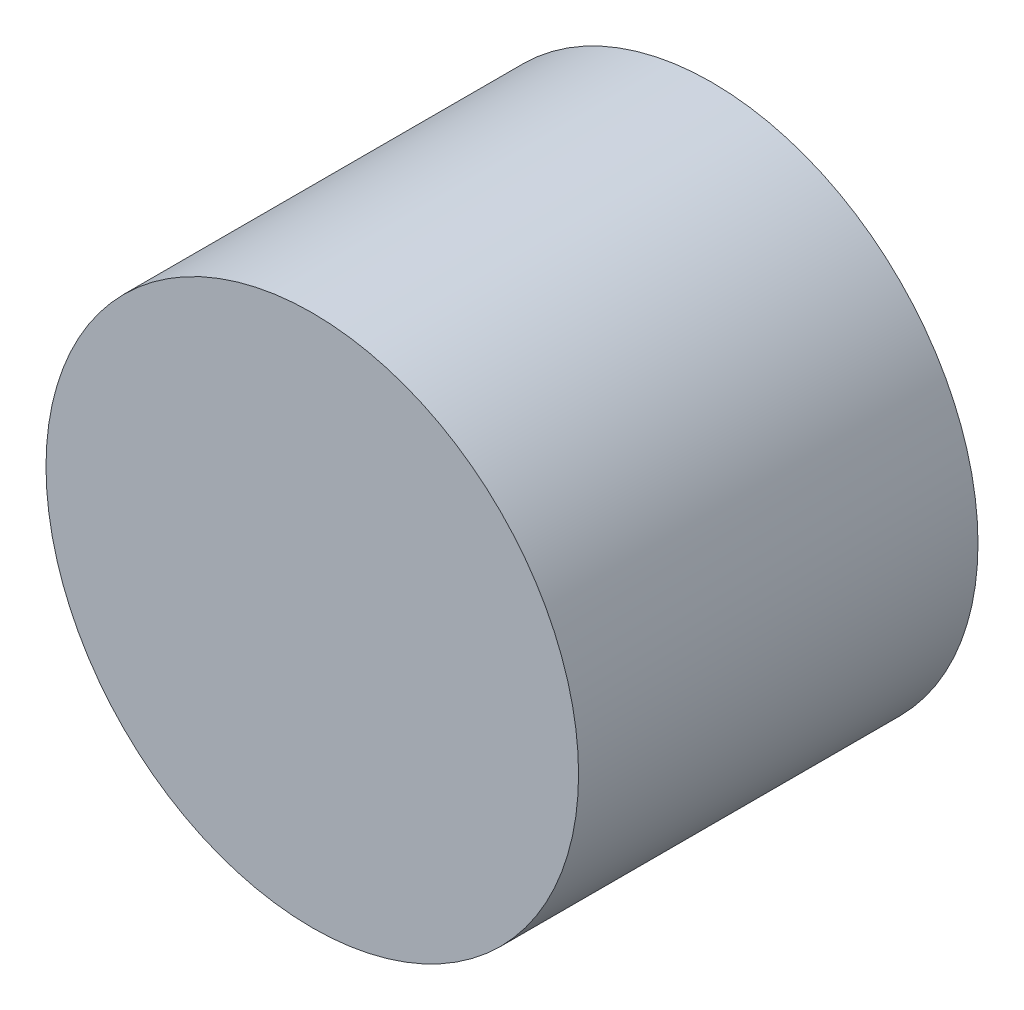
ISO-10303-21;
HEADER;
FILE_DESCRIPTION(('STEP AP214'),'2;1');
FILE_NAME('part.step','',(''),(''),'','','');
FILE_SCHEMA(('AUTOMOTIVE_DESIGN { 1 0 10303 214 1 1 1 1 }'));
ENDSEC;
DATA;
#1=APPLICATION_CONTEXT('core data for automotive mechanical design processes');
#2=APPLICATION_PROTOCOL_DEFINITION('international standard','automotive_design',2000,#1);
#3=PRODUCT_CONTEXT('',#1,'mechanical');
#4=PRODUCT('Part','Part','',(#3));
#5=PRODUCT_RELATED_PRODUCT_CATEGORY('part','',(#4));
#6=PRODUCT_DEFINITION_FORMATION('','',#4);
#7=PRODUCT_DEFINITION_CONTEXT('part definition',#1,'design');
#8=PRODUCT_DEFINITION('design','',#6,#7);
#9=PRODUCT_DEFINITION_SHAPE('','',#8);
#10=(LENGTH_UNIT() NAMED_UNIT(*) SI_UNIT(.MILLI.,.METRE.));
#11=(NAMED_UNIT(*) PLANE_ANGLE_UNIT() SI_UNIT($,.RADIAN.));
#12=(NAMED_UNIT(*) SI_UNIT($,.STERADIAN.) SOLID_ANGLE_UNIT());
#13=UNCERTAINTY_MEASURE_WITH_UNIT(LENGTH_MEASURE(1.E-05),#10,'distance_accuracy_value','');
#14=(GEOMETRIC_REPRESENTATION_CONTEXT(3) GLOBAL_UNCERTAINTY_ASSIGNED_CONTEXT((#13)) GLOBAL_UNIT_ASSIGNED_CONTEXT((#10,
#11,#12)) REPRESENTATION_CONTEXT('',''));
#15=CARTESIAN_POINT('',(0.,0.,0.));
#16=DIRECTION('',(0.,0.,1.));
#17=DIRECTION('',(1.,0.,0.));
#18=AXIS2_PLACEMENT_3D('',#15,#16,#17);
#19=CARTESIAN_POINT('',(0.,0.,10.));
#20=DIRECTION('',(0.,0.,-1.));
#21=DIRECTION('',(-1.,0.,0.));
#22=AXIS2_PLACEMENT_3D('',#19,#20,#21);
#23=SPHERICAL_SURFACE('',#22,10.);
#24=CARTESIAN_POINT('',(0.,0.,10.));
#25=DIRECTION('',(0.,0.,-1.));
#26=DIRECTION('',(-1.,0.,0.));
#27=AXIS2_PLACEMENT_3D('',#24,#25,#26);
#28=CIRCLE('',#27,10.);
#29=CARTESIAN_POINT('',(-10.,0.,10.));
#30=VERTEX_POINT('',#29);
#31=EDGE_CURVE('E10',#30,#30,#28,.T.);
#32=ORIENTED_EDGE('',*,*,#31,.T.);
#33=EDGE_LOOP('',(#32));
#34=FACE_BOUND('',#33,.T.);
#35=ADVANCED_FACE('F37',(#34),#23,.F.);
#36=CARTESIAN_POINT('',(0.,0.,0.));
#37=DIRECTION('',(0.,0.,-1.));
#38=DIRECTION('',(-1.,0.,0.));
#39=AXIS2_PLACEMENT_3D('',#36,#37,#38);
#40=CYLINDRICAL_SURFACE('',#39,10.);
#41=ORIENTED_EDGE('',*,*,#31,.F.);
#42=EDGE_LOOP('',(#41));
#43=FACE_BOUND('',#42,.T.);
#44=CARTESIAN_POINT('',(0.,0.,0.));
#45=DIRECTION('',(0.,0.,-1.));
#46=DIRECTION('',(-1.,0.,0.));
#47=AXIS2_PLACEMENT_3D('',#44,#45,#46);
#48=CIRCLE('',#47,10.);
#49=CARTESIAN_POINT('',(-10.,0.,0.));
#50=VERTEX_POINT('',#49);
#51=EDGE_CURVE('E44',#50,#50,#48,.T.);
#52=ORIENTED_EDGE('',*,*,#51,.T.);
#53=EDGE_LOOP('',(#52));
#54=FACE_BOUND('',#53,.T.);
#55=ADVANCED_FACE('F73',(#43,#54),#40,.F.);
#56=CARTESIAN_POINT('',(0.,0.,0.));
#57=DIRECTION('',(0.,0.,1.));
#58=DIRECTION('',(1.,0.,0.));
#59=AXIS2_PLACEMENT_3D('',#56,#57,#58);
#60=PLANE('',#59);
#61=ORIENTED_EDGE('',*,*,#51,.F.);
#62=EDGE_LOOP('',(#61));
#63=FACE_BOUND('',#62,.T.);
#64=CARTESIAN_POINT('',(0.,0.,0.));
#65=DIRECTION('',(0.,0.,-1.));
#66=DIRECTION('',(-1.,0.,0.));
#67=AXIS2_PLACEMENT_3D('',#64,#65,#66);
#68=CIRCLE('',#67,20.);
#69=CARTESIAN_POINT('',(-20.,0.,0.));
#70=VERTEX_POINT('',#69);
#71=EDGE_CURVE('E49',#70,#70,#68,.T.);
#72=ORIENTED_EDGE('',*,*,#71,.T.);
#73=EDGE_LOOP('',(#72));
#74=FACE_BOUND('',#73,.T.);
#75=ADVANCED_FACE('F69',(#63,#74),#60,.F.);
#76=CARTESIAN_POINT('',(0.,0.,0.));
#77=DIRECTION('',(0.,0.,-1.));
#78=DIRECTION('',(-1.,0.,0.));
#79=AXIS2_PLACEMENT_3D('',#76,#77,#78);
#80=CYLINDRICAL_SURFACE('',#79,20.);
#81=ORIENTED_EDGE('',*,*,#71,.F.);
#82=EDGE_LOOP('',(#81));
#83=FACE_BOUND('',#82,.T.);
#84=CARTESIAN_POINT('',(0.,0.,30.));
#85=DIRECTION('',(0.,0.,-1.));
#86=DIRECTION('',(-1.,0.,0.));
#87=AXIS2_PLACEMENT_3D('',#84,#85,#86);
#88=CIRCLE('',#87,20.);
#89=CARTESIAN_POINT('',(-20.,0.,30.));
#90=VERTEX_POINT('',#89);
#91=EDGE_CURVE('E54',#90,#90,#88,.T.);
#92=ORIENTED_EDGE('',*,*,#91,.T.);
#93=EDGE_LOOP('',(#92));
#94=FACE_BOUND('',#93,.T.);
#95=ADVANCED_FACE('F61',(#83,#94),#80,.T.);
#96=CARTESIAN_POINT('',(0.,0.,30.));
#97=DIRECTION('',(0.,0.,-1.));
#98=DIRECTION('',(-1.,0.,0.));
#99=AXIS2_PLACEMENT_3D('',#96,#97,#98);
#100=PLANE('',#99);
#101=ORIENTED_EDGE('',*,*,#91,.F.);
#102=EDGE_LOOP('',(#101));
#103=FACE_BOUND('',#102,.T.);
#104=ADVANCED_FACE('F63',(#103),#100,.F.);
#105=CLOSED_SHELL('',(#35,#55,#75,#95,#104));
#106=MANIFOLD_SOLID_BREP('B2',#105);
#107=ADVANCED_BREP_SHAPE_REPRESENTATION('',(#18,#106),#14);
#108=SHAPE_DEFINITION_REPRESENTATION(#9,#107);
ENDSEC;
END-ISO-10303-21;
